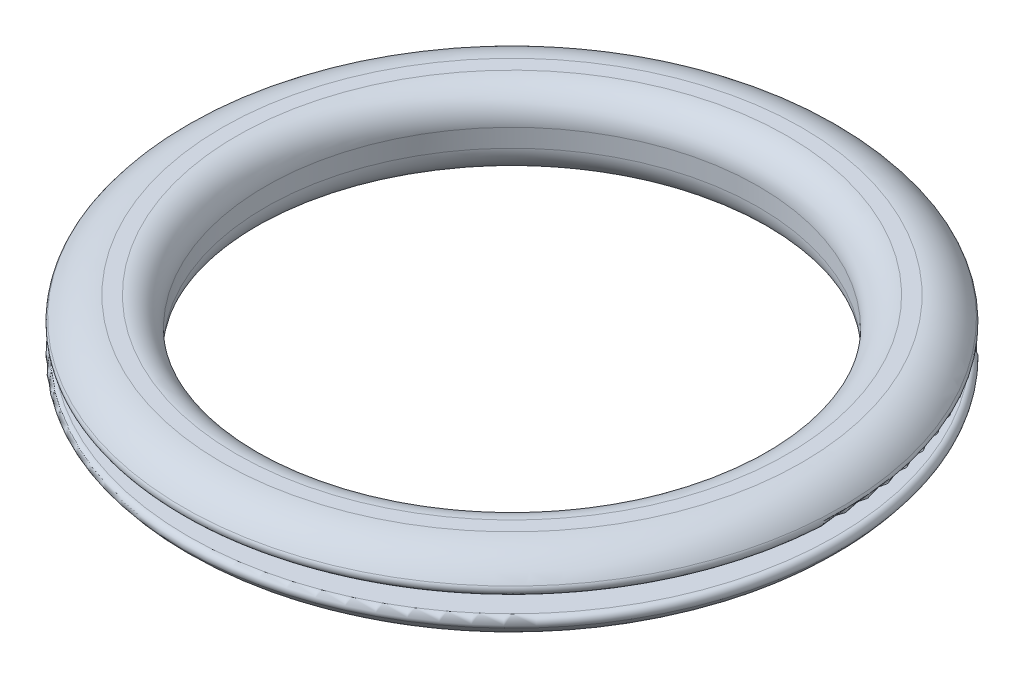
ISO-10303-21;
HEADER;
FILE_DESCRIPTION(('STEP AP214'),'2;1');
FILE_NAME('part.step','',(''),(''),'','','');
FILE_SCHEMA(('AUTOMOTIVE_DESIGN { 1 0 10303 214 1 1 1 1 }'));
ENDSEC;
DATA;
#1=APPLICATION_CONTEXT('core data for automotive mechanical design processes');
#2=APPLICATION_PROTOCOL_DEFINITION('international standard','automotive_design',2000,#1);
#3=PRODUCT_CONTEXT('',#1,'mechanical');
#4=PRODUCT('Part','Part','',(#3));
#5=PRODUCT_RELATED_PRODUCT_CATEGORY('part','',(#4));
#6=PRODUCT_DEFINITION_FORMATION('','',#4);
#7=PRODUCT_DEFINITION_CONTEXT('part definition',#1,'design');
#8=PRODUCT_DEFINITION('design','',#6,#7);
#9=PRODUCT_DEFINITION_SHAPE('','',#8);
#10=(LENGTH_UNIT() NAMED_UNIT(*) SI_UNIT(.MILLI.,.METRE.));
#11=(NAMED_UNIT(*) PLANE_ANGLE_UNIT() SI_UNIT($,.RADIAN.));
#12=(NAMED_UNIT(*) SI_UNIT($,.STERADIAN.) SOLID_ANGLE_UNIT());
#13=UNCERTAINTY_MEASURE_WITH_UNIT(LENGTH_MEASURE(1.E-05),#10,'distance_accuracy_value','');
#14=(GEOMETRIC_REPRESENTATION_CONTEXT(3) GLOBAL_UNCERTAINTY_ASSIGNED_CONTEXT((#13)) GLOBAL_UNIT_ASSIGNED_CONTEXT((#10,
#11,#12)) REPRESENTATION_CONTEXT('',''));
#15=CARTESIAN_POINT('',(0.,0.,0.));
#16=DIRECTION('',(0.,0.,1.));
#17=DIRECTION('',(1.,0.,0.));
#18=AXIS2_PLACEMENT_3D('',#15,#16,#17);
#19=CARTESIAN_POINT('',(21.59,-3.33375,0.));
#20=DIRECTION('',(0.,-1.,0.));
#21=DIRECTION('',(0.,0.,-1.));
#22=AXIS2_PLACEMENT_3D('',#19,#20,#21);
#23=PLANE('',#22);
#24=CARTESIAN_POINT('',(0.,-3.33375,0.));
#25=DIRECTION('',(0.,-1.,0.));
#26=DIRECTION('',(0.,0.,-1.));
#27=AXIS2_PLACEMENT_3D('',#24,#25,#26);
#28=CIRCLE('',#27,24.13);
#29=CARTESIAN_POINT('',(0.,-3.33375,-24.13));
#30=VERTEX_POINT('',#29);
#31=EDGE_CURVE('E65',#30,#30,#28,.F.);
#32=ORIENTED_EDGE('',*,*,#31,.T.);
#33=EDGE_LOOP('',(#32));
#34=FACE_BOUND('',#33,.T.);
#35=CARTESIAN_POINT('',(0.,-3.33375,0.));
#36=DIRECTION('',(0.,-1.,0.));
#37=DIRECTION('',(0.,0.,-1.));
#38=AXIS2_PLACEMENT_3D('',#35,#36,#37);
#39=CIRCLE('',#38,25.4);
#40=CARTESIAN_POINT('',(0.,-3.33375,-25.4));
#41=VERTEX_POINT('',#40);
#42=EDGE_CURVE('E77',#41,#41,#39,.T.);
#43=ORIENTED_EDGE('',*,*,#42,.T.);
#44=EDGE_LOOP('',(#43));
#45=FACE_BOUND('',#44,.T.);
#46=ADVANCED_FACE('F37',(#34,#45),#23,.T.);
#47=CARTESIAN_POINT('',(0.,0.793750000000001,0.));
#48=DIRECTION('',(0.,-1.,0.));
#49=DIRECTION('',(0.,0.,-1.));
#50=AXIS2_PLACEMENT_3D('',#47,#48,#49);
#51=TOROIDAL_SURFACE('',#50,25.4,4.1275);
#52=CARTESIAN_POINT('',(0.,-1.59585526315793,0.));
#53=DIRECTION('',(0.,1.,0.));
#54=DIRECTION('',(0.,0.,1.));
#55=AXIS2_PLACEMENT_3D('',#52,#53,#54);
#56=CIRCLE('',#55,28.7654186866255);
#57=CARTESIAN_POINT('',(0.,-1.59585526315793,28.7654186866255));
#58=VERTEX_POINT('',#57);
#59=EDGE_CURVE('E55',#58,#58,#56,.F.);
#60=ORIENTED_EDGE('',*,*,#59,.T.);
#61=EDGE_LOOP('',(#60));
#62=FACE_BOUND('',#61,.T.);
#63=ORIENTED_EDGE('',*,*,#42,.F.);
#64=EDGE_LOOP('',(#63));
#65=FACE_BOUND('',#64,.T.);
#66=ADVANCED_FACE('F111',(#62,#65),#51,.T.);
#67=CARTESIAN_POINT('',(29.21,-0.793750000000002,0.));
#68=DIRECTION('',(0.,1.,0.));
#69=DIRECTION('',(0.,0.,1.));
#70=AXIS2_PLACEMENT_3D('',#67,#68,#69);
#71=PLANE('',#70);
#72=CARTESIAN_POINT('',(0.,-0.793750000000002,0.));
#73=DIRECTION('',(0.,1.,0.));
#74=DIRECTION('',(0.,0.,1.));
#75=AXIS2_PLACEMENT_3D('',#72,#73,#74);
#76=CIRCLE('',#75,28.35121330981);
#77=CARTESIAN_POINT('',(0.,-0.793750000000002,28.35121330981));
#78=VERTEX_POINT('',#77);
#79=EDGE_CURVE('E50',#78,#78,#76,.T.);
#80=ORIENTED_EDGE('',*,*,#79,.T.);
#81=EDGE_LOOP('',(#80));
#82=FACE_BOUND('',#81,.T.);
#83=CARTESIAN_POINT('',(0.,-0.793750000000002,0.));
#84=DIRECTION('',(0.,-1.,0.));
#85=DIRECTION('',(0.,0.,-1.));
#86=AXIS2_PLACEMENT_3D('',#83,#84,#85);
#87=CIRCLE('',#86,25.4);
#88=CARTESIAN_POINT('',(0.,-0.793750000000002,-25.4));
#89=VERTEX_POINT('',#88);
#90=EDGE_CURVE('E81',#89,#89,#87,.T.);
#91=ORIENTED_EDGE('',*,*,#90,.T.);
#92=EDGE_LOOP('',(#91));
#93=FACE_BOUND('',#92,.T.);
#94=ADVANCED_FACE('F117',(#82,#93),#71,.T.);
#95=CARTESIAN_POINT('',(0.,0.,0.));
#96=DIRECTION('',(0.,-1.,0.));
#97=DIRECTION('',(0.,0.,-1.));
#98=AXIS2_PLACEMENT_3D('',#95,#96,#97);
#99=CYLINDRICAL_SURFACE('',#98,25.4);
#100=CARTESIAN_POINT('',(0.,0.793750000000002,0.));
#101=DIRECTION('',(0.,-1.,0.));
#102=DIRECTION('',(0.,0.,-1.));
#103=AXIS2_PLACEMENT_3D('',#100,#101,#102);
#104=CIRCLE('',#103,25.4);
#105=CARTESIAN_POINT('',(0.,0.793750000000002,-25.4));
#106=VERTEX_POINT('',#105);
#107=EDGE_CURVE('E85',#106,#106,#104,.T.);
#108=ORIENTED_EDGE('',*,*,#107,.T.);
#109=EDGE_LOOP('',(#108));
#110=FACE_BOUND('',#109,.T.);
#111=ORIENTED_EDGE('',*,*,#90,.F.);
#112=EDGE_LOOP('',(#111));
#113=FACE_BOUND('',#112,.T.);
#114=ADVANCED_FACE('F144',(#110,#113),#99,.T.);
#115=CARTESIAN_POINT('',(29.21,0.793750000000002,0.));
#116=DIRECTION('',(0.,-1.,0.));
#117=DIRECTION('',(0.,0.,-1.));
#118=AXIS2_PLACEMENT_3D('',#115,#116,#117);
#119=PLANE('',#118);
#120=CARTESIAN_POINT('',(0.,0.793750000000002,0.));
#121=DIRECTION('',(0.,-1.,0.));
#122=DIRECTION('',(0.,0.,-1.));
#123=AXIS2_PLACEMENT_3D('',#120,#121,#122);
#124=CIRCLE('',#123,28.35121330981);
#125=CARTESIAN_POINT('',(0.,0.793750000000002,-28.35121330981));
#126=VERTEX_POINT('',#125);
#127=EDGE_CURVE('E45',#126,#126,#124,.T.);
#128=ORIENTED_EDGE('',*,*,#127,.T.);
#129=EDGE_LOOP('',(#128));
#130=FACE_BOUND('',#129,.T.);
#131=ORIENTED_EDGE('',*,*,#107,.F.);
#132=EDGE_LOOP('',(#131));
#133=FACE_BOUND('',#132,.T.);
#134=ADVANCED_FACE('F108',(#130,#133),#119,.T.);
#135=CARTESIAN_POINT('',(0.,-0.793750000000001,0.));
#136=DIRECTION('',(0.,-1.,0.));
#137=DIRECTION('',(0.,0.,-1.));
#138=AXIS2_PLACEMENT_3D('',#135,#136,#137);
#139=TOROIDAL_SURFACE('',#138,25.4,4.1275);
#140=CARTESIAN_POINT('',(0.,1.59585526315793,0.));
#141=DIRECTION('',(0.,-1.,0.));
#142=DIRECTION('',(0.,0.,-1.));
#143=AXIS2_PLACEMENT_3D('',#140,#141,#142);
#144=CIRCLE('',#143,28.7654186866255);
#145=CARTESIAN_POINT('',(0.,1.59585526315793,-28.7654186866255));
#146=VERTEX_POINT('',#145);
#147=EDGE_CURVE('E10',#146,#146,#144,.F.);
#148=ORIENTED_EDGE('',*,*,#147,.T.);
#149=EDGE_LOOP('',(#148));
#150=FACE_BOUND('',#149,.T.);
#151=CARTESIAN_POINT('',(0.,3.33375,0.));
#152=DIRECTION('',(0.,-1.,0.));
#153=DIRECTION('',(0.,0.,-1.));
#154=AXIS2_PLACEMENT_3D('',#151,#152,#153);
#155=CIRCLE('',#154,25.4);
#156=CARTESIAN_POINT('',(0.,3.33375,-25.4));
#157=VERTEX_POINT('',#156);
#158=EDGE_CURVE('E89',#157,#157,#155,.T.);
#159=ORIENTED_EDGE('',*,*,#158,.T.);
#160=EDGE_LOOP('',(#159));
#161=FACE_BOUND('',#160,.T.);
#162=ADVANCED_FACE('F94',(#150,#161),#139,.T.);
#163=CARTESIAN_POINT('',(21.59,3.33375,0.));
#164=DIRECTION('',(0.,1.,0.));
#165=DIRECTION('',(0.,0.,1.));
#166=AXIS2_PLACEMENT_3D('',#163,#164,#165);
#167=PLANE('',#166);
#168=CARTESIAN_POINT('',(0.,3.33375,0.));
#169=DIRECTION('',(0.,1.,0.));
#170=DIRECTION('',(0.,0.,1.));
#171=AXIS2_PLACEMENT_3D('',#168,#169,#170);
#172=CIRCLE('',#171,24.13);
#173=CARTESIAN_POINT('',(0.,3.33375,24.13));
#174=VERTEX_POINT('',#173);
#175=EDGE_CURVE('E61',#174,#174,#172,.F.);
#176=ORIENTED_EDGE('',*,*,#175,.T.);
#177=EDGE_LOOP('',(#176));
#178=FACE_BOUND('',#177,.T.);
#179=ORIENTED_EDGE('',*,*,#158,.F.);
#180=EDGE_LOOP('',(#179));
#181=FACE_BOUND('',#180,.T.);
#182=ADVANCED_FACE('F96',(#178,#181),#167,.T.);
#183=CARTESIAN_POINT('',(0.,0.,0.));
#184=DIRECTION('',(0.,-1.,0.));
#185=DIRECTION('',(0.,0.,-1.));
#186=AXIS2_PLACEMENT_3D('',#183,#184,#185);
#187=CYLINDRICAL_SURFACE('',#186,21.59);
#188=CARTESIAN_POINT('',(0.,-0.793749999999998,0.));
#189=DIRECTION('',(0.,-1.,0.));
#190=DIRECTION('',(0.,0.,-1.));
#191=AXIS2_PLACEMENT_3D('',#188,#189,#190);
#192=CIRCLE('',#191,21.59);
#193=CARTESIAN_POINT('',(0.,-0.793749999999998,-21.59));
#194=VERTEX_POINT('',#193);
#195=EDGE_CURVE('E69',#194,#194,#192,.T.);
#196=ORIENTED_EDGE('',*,*,#195,.T.);
#197=EDGE_LOOP('',(#196));
#198=FACE_BOUND('',#197,.T.);
#199=CARTESIAN_POINT('',(0.,0.793749999999998,0.));
#200=DIRECTION('',(0.,1.,0.));
#201=DIRECTION('',(0.,0.,1.));
#202=AXIS2_PLACEMENT_3D('',#199,#200,#201);
#203=CIRCLE('',#202,21.59);
#204=CARTESIAN_POINT('',(0.,0.793749999999998,21.59));
#205=VERTEX_POINT('',#204);
#206=EDGE_CURVE('E73',#205,#205,#203,.T.);
#207=ORIENTED_EDGE('',*,*,#206,.T.);
#208=EDGE_LOOP('',(#207));
#209=FACE_BOUND('',#208,.T.);
#210=ADVANCED_FACE('F98',(#198,#209),#187,.F.);
#211=CARTESIAN_POINT('',(0.,-0.793749999999998,0.));
#212=DIRECTION('',(0.,-1.,0.));
#213=DIRECTION('',(0.,0.,-1.));
#214=AXIS2_PLACEMENT_3D('',#211,#212,#213);
#215=TOROIDAL_SURFACE('',#214,24.13,2.54);
#216=ORIENTED_EDGE('',*,*,#31,.F.);
#217=EDGE_LOOP('',(#216));
#218=FACE_BOUND('',#217,.T.);
#219=ORIENTED_EDGE('',*,*,#195,.F.);
#220=EDGE_LOOP('',(#219));
#221=FACE_BOUND('',#220,.T.);
#222=ADVANCED_FACE('F105',(#218,#221),#215,.T.);
#223=CARTESIAN_POINT('',(0.,0.793749999999998,0.));
#224=DIRECTION('',(0.,1.,0.));
#225=DIRECTION('',(0.,0.,1.));
#226=AXIS2_PLACEMENT_3D('',#223,#224,#225);
#227=TOROIDAL_SURFACE('',#226,24.13,2.54);
#228=ORIENTED_EDGE('',*,*,#206,.F.);
#229=EDGE_LOOP('',(#228));
#230=FACE_BOUND('',#229,.T.);
#231=ORIENTED_EDGE('',*,*,#175,.F.);
#232=EDGE_LOOP('',(#231));
#233=FACE_BOUND('',#232,.T.);
#234=ADVANCED_FACE('F125',(#230,#233),#227,.T.);
#235=CARTESIAN_POINT('',(0.,-1.30175,0.));
#236=DIRECTION('',(0.,1.,0.));
#237=DIRECTION('',(0.,0.,1.));
#238=AXIS2_PLACEMENT_3D('',#235,#236,#237);
#239=TOROIDAL_SURFACE('',#238,28.35121330981,0.508);
#240=ORIENTED_EDGE('',*,*,#79,.F.);
#241=EDGE_LOOP('',(#240));
#242=FACE_BOUND('',#241,.T.);
#243=ORIENTED_EDGE('',*,*,#59,.F.);
#244=EDGE_LOOP('',(#243));
#245=FACE_BOUND('',#244,.T.);
#246=ADVANCED_FACE('F128',(#242,#245),#239,.T.);
#247=CARTESIAN_POINT('',(0.,1.30175,0.));
#248=DIRECTION('',(0.,-1.,0.));
#249=DIRECTION('',(0.,0.,-1.));
#250=AXIS2_PLACEMENT_3D('',#247,#248,#249);
#251=TOROIDAL_SURFACE('',#250,28.35121330981,0.508);
#252=ORIENTED_EDGE('',*,*,#147,.F.);
#253=EDGE_LOOP('',(#252));
#254=FACE_BOUND('',#253,.T.);
#255=ORIENTED_EDGE('',*,*,#127,.F.);
#256=EDGE_LOOP('',(#255));
#257=FACE_BOUND('',#256,.T.);
#258=ADVANCED_FACE('F39',(#254,#257),#251,.T.);
#259=CLOSED_SHELL('',(#46,#66,#94,#114,#134,#162,#182,#210,#222,#234,#246,#258));
#260=MANIFOLD_SOLID_BREP('B2',#259);
#261=ADVANCED_BREP_SHAPE_REPRESENTATION('',(#18,#260),#14);
#262=SHAPE_DEFINITION_REPRESENTATION(#9,#261);
ENDSEC;
END-ISO-10303-21;
